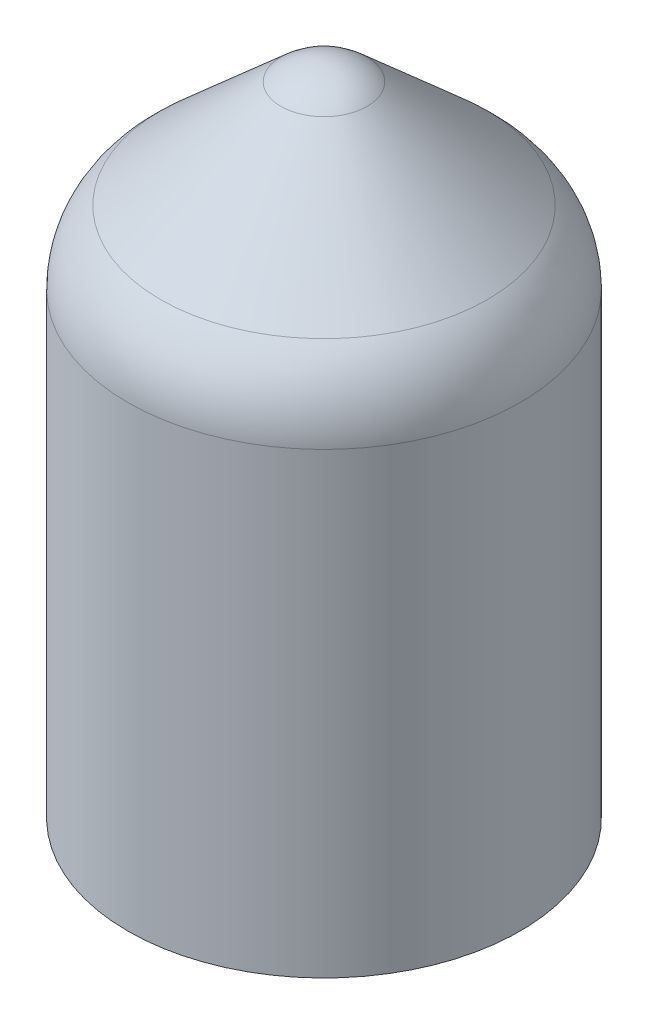
ISO-10303-21;
HEADER;
FILE_DESCRIPTION(('STEP AP214'),'2;1');
FILE_NAME('part.step','',(''),(''),'','','');
FILE_SCHEMA(('AUTOMOTIVE_DESIGN { 1 0 10303 214 1 1 1 1 }'));
ENDSEC;
DATA;
#1=APPLICATION_CONTEXT('core data for automotive mechanical design processes');
#2=APPLICATION_PROTOCOL_DEFINITION('international standard','automotive_design',2000,#1);
#3=PRODUCT_CONTEXT('',#1,'mechanical');
#4=PRODUCT('Part','Part','',(#3));
#5=PRODUCT_RELATED_PRODUCT_CATEGORY('part','',(#4));
#6=PRODUCT_DEFINITION_FORMATION('','',#4);
#7=PRODUCT_DEFINITION_CONTEXT('part definition',#1,'design');
#8=PRODUCT_DEFINITION('design','',#6,#7);
#9=PRODUCT_DEFINITION_SHAPE('','',#8);
#10=(LENGTH_UNIT() NAMED_UNIT(*) SI_UNIT(.MILLI.,.METRE.));
#11=(NAMED_UNIT(*) PLANE_ANGLE_UNIT() SI_UNIT($,.RADIAN.));
#12=(NAMED_UNIT(*) SI_UNIT($,.STERADIAN.) SOLID_ANGLE_UNIT());
#13=UNCERTAINTY_MEASURE_WITH_UNIT(LENGTH_MEASURE(1.E-05),#10,'distance_accuracy_value','');
#14=(GEOMETRIC_REPRESENTATION_CONTEXT(3) GLOBAL_UNCERTAINTY_ASSIGNED_CONTEXT((#13)) GLOBAL_UNIT_ASSIGNED_CONTEXT((#10,
#11,#12)) REPRESENTATION_CONTEXT('',''));
#15=CARTESIAN_POINT('',(0.,0.,0.));
#16=DIRECTION('',(0.,0.,1.));
#17=DIRECTION('',(1.,0.,0.));
#18=AXIS2_PLACEMENT_3D('',#15,#16,#17);
#19=CARTESIAN_POINT('',(60.,0.,0.));
#20=DIRECTION('',(0.,-1.,0.));
#21=DIRECTION('',(0.,0.,-1.));
#22=AXIS2_PLACEMENT_3D('',#19,#20,#21);
#23=PLANE('',#22);
#24=CARTESIAN_POINT('',(0.,0.,0.));
#25=DIRECTION('',(0.,-1.,0.));
#26=DIRECTION('',(0.,0.,-1.));
#27=AXIS2_PLACEMENT_3D('',#24,#25,#26);
#28=CIRCLE('',#27,58.);
#29=CARTESIAN_POINT('',(0.,0.,-58.));
#30=VERTEX_POINT('',#29);
#31=EDGE_CURVE('E50',#30,#30,#28,.T.);
#32=ORIENTED_EDGE('',*,*,#31,.F.);
#33=EDGE_LOOP('',(#32));
#34=FACE_BOUND('',#33,.T.);
#35=CARTESIAN_POINT('',(0.,0.,0.));
#36=DIRECTION('',(0.,-1.,0.));
#37=DIRECTION('',(0.,0.,-1.));
#38=AXIS2_PLACEMENT_3D('',#35,#36,#37);
#39=CIRCLE('',#38,60.);
#40=CARTESIAN_POINT('',(0.,0.,-60.));
#41=VERTEX_POINT('',#40);
#42=EDGE_CURVE('E10',#41,#41,#39,.T.);
#43=ORIENTED_EDGE('',*,*,#42,.T.);
#44=EDGE_LOOP('',(#43));
#45=FACE_BOUND('',#44,.T.);
#46=ADVANCED_FACE('F31',(#34,#45),#23,.T.);
#47=CARTESIAN_POINT('',(0.,0.,0.));
#48=DIRECTION('',(0.,-1.,0.));
#49=DIRECTION('',(0.,0.,-1.));
#50=AXIS2_PLACEMENT_3D('',#47,#48,#49);
#51=CYLINDRICAL_SURFACE('',#50,60.);
#52=CARTESIAN_POINT('',(0.,140.,0.));
#53=DIRECTION('',(0.,-1.,0.));
#54=DIRECTION('',(0.,0.,-1.));
#55=AXIS2_PLACEMENT_3D('',#52,#53,#54);
#56=CIRCLE('',#55,60.);
#57=CARTESIAN_POINT('',(0.,140.,-60.));
#58=VERTEX_POINT('',#57);
#59=EDGE_CURVE('E37',#58,#58,#56,.T.);
#60=ORIENTED_EDGE('',*,*,#59,.T.);
#61=EDGE_LOOP('',(#60));
#62=FACE_BOUND('',#61,.T.);
#63=ORIENTED_EDGE('',*,*,#42,.F.);
#64=EDGE_LOOP('',(#63));
#65=FACE_BOUND('',#64,.T.);
#66=ADVANCED_FACE('F73',(#62,#65),#51,.T.);
#67=CARTESIAN_POINT('',(0.,140.,0.));
#68=DIRECTION('',(0.,-1.,0.));
#69=DIRECTION('',(0.,0.,-1.));
#70=AXIS2_PLACEMENT_3D('',#67,#68,#69);
#71=TOROIDAL_SURFACE('',#70,30.2193554938954,29.7806445061046);
#72=CARTESIAN_POINT('',(0.,162.262364881613,0.));
#73=DIRECTION('',(0.,-1.,0.));
#74=DIRECTION('',(0.,0.,-1.));
#75=AXIS2_PLACEMENT_3D('',#72,#73,#74);
#76=CIRCLE('',#75,50.);
#77=CARTESIAN_POINT('',(0.,162.262364881613,-50.));
#78=VERTEX_POINT('',#77);
#79=EDGE_CURVE('E41',#78,#78,#76,.T.);
#80=ORIENTED_EDGE('',*,*,#79,.T.);
#81=EDGE_LOOP('',(#80));
#82=FACE_BOUND('',#81,.T.);
#83=ORIENTED_EDGE('',*,*,#59,.F.);
#84=EDGE_LOOP('',(#83));
#85=FACE_BOUND('',#84,.T.);
#86=ADVANCED_FACE('F77',(#82,#85),#71,.T.);
#87=CARTESIAN_POINT('',(0.,162.262364881613,0.));
#88=DIRECTION('',(0.,-1.,0.));
#89=DIRECTION('',(0.,0.,-1.));
#90=AXIS2_PLACEMENT_3D('',#87,#88,#89);
#91=CONICAL_SURFACE('',#90,50.,0.844357882331418);
#92=CARTESIAN_POINT('',(0.,195.,0.));
#93=DIRECTION('',(0.,-1.,0.));
#94=DIRECTION('',(0.,0.,-1.));
#95=AXIS2_PLACEMENT_3D('',#92,#93,#94);
#96=CIRCLE('',#95,13.1550337936806);
#97=CARTESIAN_POINT('',(0.,195.,-13.1550337936806));
#98=VERTEX_POINT('',#97);
#99=EDGE_CURVE('E45',#98,#98,#96,.T.);
#100=CARTESIAN_POINT('',(0.,195.,-13.1550337936806));
#101=CARTESIAN_POINT('',(0.,194.658982967517,-13.5388355249965));
#102=CARTESIAN_POINT('',(0.,194.317965935034,-13.9226372563123));
#103=CARTESIAN_POINT('',(0.,193.635931870067,-14.6902407189439));
#104=CARTESIAN_POINT('',(0.,193.294914837584,-15.0740424502598));
#105=CARTESIAN_POINT('',(0.,192.612880772618,-15.8416459128914));
#106=CARTESIAN_POINT('',(0.,192.271863740134,-16.2254476442072));
#107=CARTESIAN_POINT('',(0.,191.589829675168,-16.9930511068389));
#108=CARTESIAN_POINT('',(0.,191.248812642685,-17.3768528381547));
#109=CARTESIAN_POINT('',(0.,190.566778577719,-18.1444563007864));
#110=CARTESIAN_POINT('',(0.,190.225761545235,-18.5282580321022));
#111=CARTESIAN_POINT('',(0.,189.543727480269,-19.2958614947339));
#112=CARTESIAN_POINT('',(0.,189.202710447786,-19.6796632260497));
#113=CARTESIAN_POINT('',(0.,188.520676382819,-20.4472666886813));
#114=CARTESIAN_POINT('',(0.,188.179659350336,-20.8310684199972));
#115=CARTESIAN_POINT('',(0.,187.49762528537,-21.5986718826288));
#116=CARTESIAN_POINT('',(0.,187.156608252887,-21.9824736139447));
#117=CARTESIAN_POINT('',(0.,186.47457418792,-22.7500770765763));
#118=CARTESIAN_POINT('',(0.,186.133557155437,-23.1338788078921));
#119=CARTESIAN_POINT('',(0.,185.451523090471,-23.9014822705238));
#120=CARTESIAN_POINT('',(0.,185.110506057987,-24.2852840018396));
#121=CARTESIAN_POINT('',(0.,184.428471993021,-25.0528874644713));
#122=CARTESIAN_POINT('',(0.,184.087454960538,-25.4366891957871));
#123=CARTESIAN_POINT('',(0.,183.405420895571,-26.2042926584187));
#124=CARTESIAN_POINT('',(0.,183.064403863088,-26.5880943897346));
#125=CARTESIAN_POINT('',(0.,182.382369798122,-27.3556978523662));
#126=CARTESIAN_POINT('',(0.,182.041352765639,-27.7394995836821));
#127=CARTESIAN_POINT('',(0.,181.359318700672,-28.5071030463137));
#128=CARTESIAN_POINT('',(0.,181.018301668189,-28.8909047776295));
#129=CARTESIAN_POINT('',(0.,180.336267603223,-29.6585082402612));
#130=CARTESIAN_POINT('',(0.,179.995250570739,-30.042309971577));
#131=CARTESIAN_POINT('',(0.,179.313216505773,-30.8099134342087));
#132=CARTESIAN_POINT('',(0.,178.97219947329,-31.1937151655245));
#133=CARTESIAN_POINT('',(0.,178.290165408324,-31.9613186281562));
#134=CARTESIAN_POINT('',(0.,177.94914837584,-32.345120359472));
#135=CARTESIAN_POINT('',(0.,177.267114310874,-33.1127238221036));
#136=CARTESIAN_POINT('',(0.,176.926097278391,-33.4965255534194));
#137=CARTESIAN_POINT('',(0.,176.244063213424,-34.2641290160511));
#138=CARTESIAN_POINT('',(0.,175.903046180941,-34.6479307473669));
#139=CARTESIAN_POINT('',(0.,175.221012115975,-35.4155342099986));
#140=CARTESIAN_POINT('',(0.,174.879995083492,-35.7993359413144));
#141=CARTESIAN_POINT('',(0.,174.197961018525,-36.5669394039461));
#142=CARTESIAN_POINT('',(0.,173.856943986042,-36.9507411352619));
#143=CARTESIAN_POINT('',(0.,173.174909921076,-37.7183445978935));
#144=CARTESIAN_POINT('',(0.,172.833892888592,-38.1021463292094));
#145=CARTESIAN_POINT('',(0.,172.151858823626,-38.869749791841));
#146=CARTESIAN_POINT('',(0.,171.810841791143,-39.2535515231569));
#147=CARTESIAN_POINT('',(0.,171.128807726176,-40.0211549857885));
#148=CARTESIAN_POINT('',(0.,170.787790693693,-40.4049567171043));
#149=CARTESIAN_POINT('',(0.,170.105756628727,-41.172560179736));
#150=CARTESIAN_POINT('',(0.,169.764739596244,-41.5563619110518));
#151=CARTESIAN_POINT('',(0.,169.082705531277,-42.3239653736835));
#152=CARTESIAN_POINT('',(0.,168.741688498794,-42.7077671049993));
#153=CARTESIAN_POINT('',(0.,168.059654433828,-43.475370567631));
#154=CARTESIAN_POINT('',(0.,167.718637401344,-43.8591722989468));
#155=CARTESIAN_POINT('',(0.,167.036603336378,-44.6267757615784));
#156=CARTESIAN_POINT('',(0.,166.695586303895,-45.0105774928943));
#157=CARTESIAN_POINT('',(0.,166.013552238929,-45.7781809555259));
#158=CARTESIAN_POINT('',(0.,165.672535206445,-46.1619826868417));
#159=CARTESIAN_POINT('',(0.,164.990501141479,-46.9295861494734));
#160=CARTESIAN_POINT('',(0.,164.649484108996,-47.3133878807892));
#161=CARTESIAN_POINT('',(0.,163.967450044029,-48.0809913434209));
#162=CARTESIAN_POINT('',(0.,163.626433011546,-48.4647930747367));
#163=CARTESIAN_POINT('',(0.,162.94439894658,-49.2323965373684));
#164=CARTESIAN_POINT('',(0.,162.603381914097,-49.6161982686842));
#165=CARTESIAN_POINT('',(0.,162.262364881613,-50.));
#166=B_SPLINE_CURVE_WITH_KNOTS('',3,(#100,#101,#102,#103,#104,#105,#106,#107,#108,#109,#110,
#111,#112,#113,#114,#115,#116,#117,#118,#119,#120,#121,#122,#123,#124,#125,#126,#127,#128,#129,
#130,#131,#132,#133,#134,#135,#136,#137,#138,#139,#140,#141,#142,#143,#144,#145,#146,#147,#148,
#149,#150,#151,#152,#153,#154,#155,#156,#157,#158,#159,#160,#161,#162,#163,#164,#165),
.UNSPECIFIED.,.F.,.F.,(4,2,2,2,2,2,2,2,2,2,2,2,2,2,2,2,2,2,2,2,2,2,2,2,2,2,2,2,2,2,2,2,4),(0.,
1.54024915797478,3.08049831594956,4.62074747392435,6.16099663189913,7.70124578987391,
9.2414949478487,10.7817441058235,12.3219932637983,13.8622424217731,15.4024915797478,
16.9427407377226,18.4829898956974,20.0232390536722,21.563488211647,23.1037373696218,
24.6439865275965,26.1842356855713,27.7244848435461,29.2647340015209,30.8049831594957,
32.3452323174705,33.8854814754452,35.42573063342,36.9659797913948,38.5062289493696,
40.0464781073444,41.5867272653192,43.1269764232939,44.6672255812687,46.2074747392435,
47.7477238972183,49.2879730551931),.UNSPECIFIED.);
#167=EDGE_CURVE('BSEAM81',#98,#78,#166,.T.);
#168=ORIENTED_EDGE('',*,*,#99,.T.);
#169=ORIENTED_EDGE('',*,*,#79,.F.);
#170=ORIENTED_EDGE('',*,*,#167,.T.);
#171=ORIENTED_EDGE('',*,*,#167,.F.);
#172=EDGE_LOOP('',(#168,#170,#169,#171));
#173=FACE_BOUND('',#172,.T.);
#174=ADVANCED_FACE('F81',(#173),#91,.T.);
#175=CARTESIAN_POINT('',(0.,180.194508588712,0.));
#176=DIRECTION('',(0.,-1.,0.));
#177=DIRECTION('',(1.,0.,0.));
#178=AXIS2_PLACEMENT_3D('',#175,#176,#177);
#179=SPHERICAL_SURFACE('',#178,19.805491411288);
#180=ORIENTED_EDGE('',*,*,#99,.F.);
#181=EDGE_LOOP('',(#180));
#182=FACE_BOUND('',#181,.T.);
#183=ADVANCED_FACE('F68',(#182),#179,.T.);
#184=CARTESIAN_POINT('',(0.,0.,0.));
#185=DIRECTION('',(0.,-1.,0.));
#186=DIRECTION('',(0.,0.,-1.));
#187=AXIS2_PLACEMENT_3D('',#184,#185,#186);
#188=CYLINDRICAL_SURFACE('',#187,58.);
#189=CARTESIAN_POINT('',(0.,140.,0.));
#190=DIRECTION('',(0.,-1.,0.));
#191=DIRECTION('',(0.,0.,-1.));
#192=AXIS2_PLACEMENT_3D('',#189,#190,#191);
#193=CIRCLE('',#192,58.);
#194=CARTESIAN_POINT('',(0.,140.,-58.));
#195=VERTEX_POINT('',#194);
#196=EDGE_CURVE('E53',#195,#195,#193,.T.);
#197=ORIENTED_EDGE('',*,*,#196,.F.);
#198=EDGE_LOOP('',(#197));
#199=FACE_BOUND('',#198,.T.);
#200=ORIENTED_EDGE('',*,*,#31,.T.);
#201=EDGE_LOOP('',(#200));
#202=FACE_BOUND('',#201,.T.);
#203=ADVANCED_FACE('F65',(#199,#202),#188,.F.);
#204=CARTESIAN_POINT('',(0.,140.,0.));
#205=DIRECTION('',(0.,-1.,0.));
#206=DIRECTION('',(0.,0.,-1.));
#207=AXIS2_PLACEMENT_3D('',#204,#205,#206);
#208=TOROIDAL_SURFACE('',#207,30.2193554938954,27.7806445061046);
#209=CARTESIAN_POINT('',(0.,160.767275352772,0.));
#210=DIRECTION('',(0.,-1.,0.));
#211=DIRECTION('',(0.,0.,-1.));
#212=AXIS2_PLACEMENT_3D('',#209,#210,#211);
#213=CIRCLE('',#212,48.6715771378252);
#214=CARTESIAN_POINT('',(0.,160.767275352772,-48.6715771378252));
#215=VERTEX_POINT('',#214);
#216=EDGE_CURVE('E57',#215,#215,#213,.T.);
#217=ORIENTED_EDGE('',*,*,#216,.F.);
#218=EDGE_LOOP('',(#217));
#219=FACE_BOUND('',#218,.T.);
#220=ORIENTED_EDGE('',*,*,#196,.T.);
#221=EDGE_LOOP('',(#220));
#222=FACE_BOUND('',#221,.T.);
#223=ADVANCED_FACE('F63',(#219,#222),#208,.F.);
#224=CARTESIAN_POINT('',(0.,160.767275352772,0.));
#225=DIRECTION('',(0.,-1.,0.));
#226=DIRECTION('',(0.,0.,-1.));
#227=AXIS2_PLACEMENT_3D('',#224,#225,#226);
#228=CONICAL_SURFACE('',#227,48.6715771378252,0.844357882331418);
#229=CARTESIAN_POINT('',(0.,193.504910471159,0.));
#230=DIRECTION('',(0.,-1.,0.));
#231=DIRECTION('',(0.,0.,-1.));
#232=AXIS2_PLACEMENT_3D('',#229,#230,#231);
#233=CIRCLE('',#232,11.8266109315059);
#234=CARTESIAN_POINT('',(0.,193.504910471159,-11.8266109315058));
#235=VERTEX_POINT('',#234);
#236=EDGE_CURVE('E54',#235,#235,#233,.T.);
#237=CARTESIAN_POINT('',(0.,193.504910471159,-11.8266109315058));
#238=CARTESIAN_POINT('',(0.,193.163893438675,-12.2104126628217));
#239=CARTESIAN_POINT('',(0.,192.822876406192,-12.5942143941375));
#240=CARTESIAN_POINT('',(0.,192.140842341226,-13.3618178567692));
#241=CARTESIAN_POINT('',(0.,191.799825308743,-13.745619588085));
#242=CARTESIAN_POINT('',(0.,191.117791243776,-14.5132230507166));
#243=CARTESIAN_POINT('',(0.,190.776774211293,-14.8970247820325));
#244=CARTESIAN_POINT('',(0.,190.094740146327,-15.6646282446641));
#245=CARTESIAN_POINT('',(0.,189.753723113843,-16.0484299759799));
#246=CARTESIAN_POINT('',(0.,189.071689048877,-16.8160334386116));
#247=CARTESIAN_POINT('',(0.,188.730672016394,-17.1998351699274));
#248=CARTESIAN_POINT('',(0.,188.048637951427,-17.9674386325591));
#249=CARTESIAN_POINT('',(0.,187.707620918944,-18.3512403638749));
#250=CARTESIAN_POINT('',(0.,187.025586853978,-19.1188438265066));
#251=CARTESIAN_POINT('',(0.,186.684569821495,-19.5026455578224));
#252=CARTESIAN_POINT('',(0.,186.002535756528,-20.270249020454));
#253=CARTESIAN_POINT('',(0.,185.661518724045,-20.6540507517699));
#254=CARTESIAN_POINT('',(0.,184.979484659079,-21.4216542144015));
#255=CARTESIAN_POINT('',(0.,184.638467626596,-21.8054559457173));
#256=CARTESIAN_POINT('',(0.,183.956433561629,-22.573059408349));
#257=CARTESIAN_POINT('',(0.,183.615416529146,-22.9568611396648));
#258=CARTESIAN_POINT('',(0.,182.93338246418,-23.7244646022965));
#259=CARTESIAN_POINT('',(0.,182.592365431696,-24.1082663336123));
#260=CARTESIAN_POINT('',(0.,181.91033136673,-24.875869796244));
#261=CARTESIAN_POINT('',(0.,181.569314334247,-25.2596715275598));
#262=CARTESIAN_POINT('',(0.,180.88728026928,-26.0272749901914));
#263=CARTESIAN_POINT('',(0.,180.546263236797,-26.4110767215073));
#264=CARTESIAN_POINT('',(0.,179.864229171831,-27.1786801841389));
#265=CARTESIAN_POINT('',(0.,179.523212139348,-27.5624819154547));
#266=CARTESIAN_POINT('',(0.,178.841178074381,-28.3300853780864));
#267=CARTESIAN_POINT('',(0.,178.500161041898,-28.7138871094022));
#268=CARTESIAN_POINT('',(0.,177.818126976932,-29.4814905720339));
#269=CARTESIAN_POINT('',(0.,177.477109944448,-29.8652923033497));
#270=CARTESIAN_POINT('',(0.,176.795075879482,-30.6328957659814));
#271=CARTESIAN_POINT('',(0.,176.454058846999,-31.0166974972972));
#272=CARTESIAN_POINT('',(0.,175.772024782032,-31.7843009599288));
#273=CARTESIAN_POINT('',(0.,175.431007749549,-32.1681026912447));
#274=CARTESIAN_POINT('',(0.,174.748973684583,-32.9357061538763));
#275=CARTESIAN_POINT('',(0.,174.4079566521,-33.3195078851921));
#276=CARTESIAN_POINT('',(0.,173.725922587133,-34.0871113478238));
#277=CARTESIAN_POINT('',(0.,173.38490555465,-34.4709130791396));
#278=CARTESIAN_POINT('',(0.,172.702871489684,-35.2385165417713));
#279=CARTESIAN_POINT('',(0.,172.361854457201,-35.6223182730871));
#280=CARTESIAN_POINT('',(0.,171.679820392234,-36.3899217357188));
#281=CARTESIAN_POINT('',(0.,171.338803359751,-36.7737234670346));
#282=CARTESIAN_POINT('',(0.,170.656769294785,-37.5413269296662));
#283=CARTESIAN_POINT('',(0.,170.315752262301,-37.9251286609821));
#284=CARTESIAN_POINT('',(0.,169.633718197335,-38.6927321236137));
#285=CARTESIAN_POINT('',(0.,169.292701164852,-39.0765338549296));
#286=CARTESIAN_POINT('',(0.,168.610667099885,-39.8441373175612));
#287=CARTESIAN_POINT('',(0.,168.269650067402,-40.227939048877));
#288=CARTESIAN_POINT('',(0.,167.587616002436,-40.9955425115087));
#289=CARTESIAN_POINT('',(0.,167.246598969953,-41.3793442428245));
#290=CARTESIAN_POINT('',(0.,166.564564904986,-42.1469477054562));
#291=CARTESIAN_POINT('',(0.,166.223547872503,-42.530749436772));
#292=CARTESIAN_POINT('',(0.,165.541513807537,-43.2983528994036));
#293=CARTESIAN_POINT('',(0.,165.200496775053,-43.6821546307195));
#294=CARTESIAN_POINT('',(0.,164.518462710087,-44.4497580933511));
#295=CARTESIAN_POINT('',(0.,164.177445677604,-44.833559824667));
#296=CARTESIAN_POINT('',(0.,163.495411612637,-45.6011632872986));
#297=CARTESIAN_POINT('',(0.,163.154394580154,-45.9849650186144));
#298=CARTESIAN_POINT('',(0.,162.472360515188,-46.7525684812461));
#299=CARTESIAN_POINT('',(0.,162.131343482705,-47.1363702125619));
#300=CARTESIAN_POINT('',(0.,161.449309417738,-47.9039736751936));
#301=CARTESIAN_POINT('',(0.,161.108292385255,-48.2877754065094));
#302=CARTESIAN_POINT('',(0.,160.767275352772,-48.6715771378252));
#303=B_SPLINE_CURVE_WITH_KNOTS('',3,(#237,#238,#239,#240,#241,#242,#243,#244,#245,#246,#247,
#248,#249,#250,#251,#252,#253,#254,#255,#256,#257,#258,#259,#260,#261,#262,#263,#264,#265,#266,
#267,#268,#269,#270,#271,#272,#273,#274,#275,#276,#277,#278,#279,#280,#281,#282,#283,#284,#285,
#286,#287,#288,#289,#290,#291,#292,#293,#294,#295,#296,#297,#298,#299,#300,#301,#302),
.UNSPECIFIED.,.F.,.F.,(4,2,2,2,2,2,2,2,2,2,2,2,2,2,2,2,2,2,2,2,2,2,2,2,2,2,2,2,2,2,2,2,4),(0.,
1.54024915797479,3.08049831594957,4.62074747392435,6.16099663189915,7.70124578987393,
9.2414949478487,10.7817441058235,12.3219932637983,13.8622424217731,15.4024915797479,
16.9427407377226,18.4829898956974,20.0232390536722,21.563488211647,23.1037373696218,
24.6439865275966,26.1842356855713,27.7244848435461,29.2647340015209,30.8049831594957,
32.3452323174705,33.8854814754453,35.42573063342,36.9659797913948,38.5062289493696,
40.0464781073444,41.5867272653192,43.126976423294,44.6672255812688,46.2074747392435,
47.7477238972183,49.2879730551931),.UNSPECIFIED.);
#304=EDGE_CURVE('BSEAM95',#235,#215,#303,.T.);
#305=ORIENTED_EDGE('',*,*,#236,.F.);
#306=ORIENTED_EDGE('',*,*,#216,.T.);
#307=ORIENTED_EDGE('',*,*,#304,.T.);
#308=ORIENTED_EDGE('',*,*,#304,.F.);
#309=EDGE_LOOP('',(#305,#307,#306,#308));
#310=FACE_BOUND('',#309,.T.);
#311=ADVANCED_FACE('F95',(#310),#228,.F.);
#312=CARTESIAN_POINT('',(0.,180.194508588712,0.));
#313=DIRECTION('',(0.,-1.,0.));
#314=DIRECTION('',(1.,0.,0.));
#315=AXIS2_PLACEMENT_3D('',#312,#313,#314);
#316=SPHERICAL_SURFACE('',#315,17.805491411288);
#317=ORIENTED_EDGE('',*,*,#236,.T.);
#318=EDGE_LOOP('',(#317));
#319=FACE_BOUND('',#318,.T.);
#320=ADVANCED_FACE('F92',(#319),#316,.F.);
#321=CLOSED_SHELL('',(#46,#66,#86,#174,#183,#203,#223,#311,#320));
#322=MANIFOLD_SOLID_BREP('B2',#321);
#323=ADVANCED_BREP_SHAPE_REPRESENTATION('',(#18,#322),#14);
#324=SHAPE_DEFINITION_REPRESENTATION(#9,#323);
ENDSEC;
END-ISO-10303-21;
